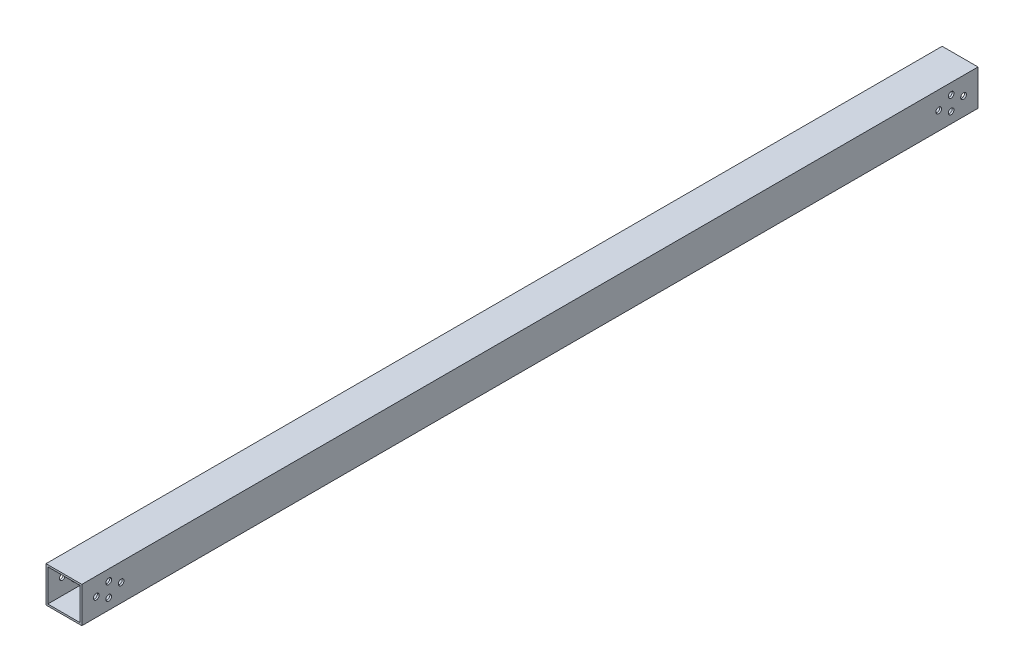
ISO-10303-21;
HEADER;
FILE_DESCRIPTION(('STEP AP214'),'2;1');
FILE_NAME('part.step','',(''),(''),'','','');
FILE_SCHEMA(('AUTOMOTIVE_DESIGN { 1 0 10303 214 1 1 1 1 }'));
ENDSEC;
DATA;
#1=APPLICATION_CONTEXT('core data for automotive mechanical design processes');
#2=APPLICATION_PROTOCOL_DEFINITION('international standard','automotive_design',2000,#1);
#3=PRODUCT_CONTEXT('',#1,'mechanical');
#4=PRODUCT('Part','Part','',(#3));
#5=PRODUCT_RELATED_PRODUCT_CATEGORY('part','',(#4));
#6=PRODUCT_DEFINITION_FORMATION('','',#4);
#7=PRODUCT_DEFINITION_CONTEXT('part definition',#1,'design');
#8=PRODUCT_DEFINITION('design','',#6,#7);
#9=PRODUCT_DEFINITION_SHAPE('','',#8);
#10=(LENGTH_UNIT() NAMED_UNIT(*) SI_UNIT(.MILLI.,.METRE.));
#11=(NAMED_UNIT(*) PLANE_ANGLE_UNIT() SI_UNIT($,.RADIAN.));
#12=(NAMED_UNIT(*) SI_UNIT($,.STERADIAN.) SOLID_ANGLE_UNIT());
#13=UNCERTAINTY_MEASURE_WITH_UNIT(LENGTH_MEASURE(1.E-05),#10,'distance_accuracy_value','');
#14=(GEOMETRIC_REPRESENTATION_CONTEXT(3) GLOBAL_UNCERTAINTY_ASSIGNED_CONTEXT((#13)) GLOBAL_UNIT_ASSIGNED_CONTEXT((#10,
#11,#12)) REPRESENTATION_CONTEXT('',''));
#15=CARTESIAN_POINT('',(0.,0.,0.));
#16=DIRECTION('',(0.,0.,1.));
#17=DIRECTION('',(1.,0.,0.));
#18=AXIS2_PLACEMENT_3D('',#15,#16,#17);
#19=CARTESIAN_POINT('',(0.,0.,500.));
#20=DIRECTION('',(0.,0.,1.));
#21=DIRECTION('',(1.,0.,0.));
#22=AXIS2_PLACEMENT_3D('',#19,#20,#21);
#23=PLANE('',#22);
#24=DIRECTION('',(0.,-1.,0.));
#25=VECTOR('',#24,1.);
#26=CARTESIAN_POINT('',(-10.,-10.,500.));
#27=LINE('',#26,#25);
#28=CARTESIAN_POINT('',(-10.,10.,500.));
#29=VERTEX_POINT('',#28);
#30=CARTESIAN_POINT('',(-10.,-10.,500.));
#31=VERTEX_POINT('',#30);
#32=EDGE_CURVE('E161',#29,#31,#27,.T.);
#33=ORIENTED_EDGE('',*,*,#32,.T.);
#34=DIRECTION('',(1.,0.,0.));
#35=VECTOR('',#34,1.);
#36=CARTESIAN_POINT('',(10.,-10.,500.));
#37=LINE('',#36,#35);
#38=CARTESIAN_POINT('',(10.,-10.,500.));
#39=VERTEX_POINT('',#38);
#40=EDGE_CURVE('E165',#31,#39,#37,.T.);
#41=ORIENTED_EDGE('',*,*,#40,.T.);
#42=DIRECTION('',(0.,1.,0.));
#43=VECTOR('',#42,1.);
#44=CARTESIAN_POINT('',(10.,-10.,500.));
#45=LINE('',#44,#43);
#46=CARTESIAN_POINT('',(10.,10.,500.));
#47=VERTEX_POINT('',#46);
#48=EDGE_CURVE('E169',#39,#47,#45,.T.);
#49=ORIENTED_EDGE('',*,*,#48,.T.);
#50=DIRECTION('',(-1.,0.,0.));
#51=VECTOR('',#50,1.);
#52=CARTESIAN_POINT('',(10.,10.,500.));
#53=LINE('',#52,#51);
#54=EDGE_CURVE('E172',#47,#29,#53,.T.);
#55=ORIENTED_EDGE('',*,*,#54,.T.);
#56=EDGE_LOOP('',(#33,#41,#49,#55));
#57=FACE_BOUND('',#56,.T.);
#58=DIRECTION('',(1.,0.,0.));
#59=VECTOR('',#58,1.);
#60=CARTESIAN_POINT('',(9.00000000000001,-9.,500.));
#61=LINE('',#60,#59);
#62=CARTESIAN_POINT('',(-9.,-9.,500.));
#63=VERTEX_POINT('',#62);
#64=CARTESIAN_POINT('',(9.00000000000001,-9.,500.));
#65=VERTEX_POINT('',#64);
#66=EDGE_CURVE('E120',#63,#65,#61,.T.);
#67=ORIENTED_EDGE('',*,*,#66,.F.);
#68=DIRECTION('',(0.,-1.,0.));
#69=VECTOR('',#68,1.);
#70=CARTESIAN_POINT('',(-9.,-9.,500.));
#71=LINE('',#70,#69);
#72=CARTESIAN_POINT('',(-9.,9.,500.));
#73=VERTEX_POINT('',#72);
#74=EDGE_CURVE('E111',#73,#63,#71,.T.);
#75=ORIENTED_EDGE('',*,*,#74,.F.);
#76=DIRECTION('',(-1.,0.,0.));
#77=VECTOR('',#76,1.);
#78=CARTESIAN_POINT('',(9.00000000000001,9.,500.));
#79=LINE('',#78,#77);
#80=CARTESIAN_POINT('',(9.00000000000001,9.,500.));
#81=VERTEX_POINT('',#80);
#82=EDGE_CURVE('E137',#81,#73,#79,.T.);
#83=ORIENTED_EDGE('',*,*,#82,.F.);
#84=DIRECTION('',(0.,1.,0.));
#85=VECTOR('',#84,1.);
#86=CARTESIAN_POINT('',(9.00000000000001,-9.,500.));
#87=LINE('',#86,#85);
#88=EDGE_CURVE('E133',#65,#81,#87,.T.);
#89=ORIENTED_EDGE('',*,*,#88,.F.);
#90=EDGE_LOOP('',(#67,#75,#83,#89));
#91=FACE_BOUND('',#90,.T.);
#92=ADVANCED_FACE('F43',(#57,#91),#23,.T.);
#93=CARTESIAN_POINT('',(0.,0.,0.));
#94=DIRECTION('',(0.,0.,1.));
#95=DIRECTION('',(1.,0.,0.));
#96=AXIS2_PLACEMENT_3D('',#93,#94,#95);
#97=PLANE('',#96);
#98=DIRECTION('',(0.,-1.,0.));
#99=VECTOR('',#98,1.);
#100=CARTESIAN_POINT('',(-10.,-10.,0.));
#101=LINE('',#100,#99);
#102=CARTESIAN_POINT('',(-10.,10.,0.));
#103=VERTEX_POINT('',#102);
#104=CARTESIAN_POINT('',(-10.,-10.,0.));
#105=VERTEX_POINT('',#104);
#106=EDGE_CURVE('E129',#103,#105,#101,.T.);
#107=ORIENTED_EDGE('',*,*,#106,.F.);
#108=DIRECTION('',(-1.,0.,0.));
#109=VECTOR('',#108,1.);
#110=CARTESIAN_POINT('',(10.,10.,0.));
#111=LINE('',#110,#109);
#112=CARTESIAN_POINT('',(10.,10.,0.));
#113=VERTEX_POINT('',#112);
#114=EDGE_CURVE('E166',#113,#103,#111,.T.);
#115=ORIENTED_EDGE('',*,*,#114,.F.);
#116=DIRECTION('',(0.,1.,0.));
#117=VECTOR('',#116,1.);
#118=CARTESIAN_POINT('',(10.,-10.,0.));
#119=LINE('',#118,#117);
#120=CARTESIAN_POINT('',(10.,-10.,0.));
#121=VERTEX_POINT('',#120);
#122=EDGE_CURVE('E182',#121,#113,#119,.T.);
#123=ORIENTED_EDGE('',*,*,#122,.F.);
#124=DIRECTION('',(1.,0.,0.));
#125=VECTOR('',#124,1.);
#126=CARTESIAN_POINT('',(10.,-10.,0.));
#127=LINE('',#126,#125);
#128=EDGE_CURVE('E179',#105,#121,#127,.T.);
#129=ORIENTED_EDGE('',*,*,#128,.F.);
#130=EDGE_LOOP('',(#107,#115,#123,#129));
#131=FACE_BOUND('',#130,.T.);
#132=DIRECTION('',(0.,-1.,0.));
#133=VECTOR('',#132,1.);
#134=CARTESIAN_POINT('',(-9.,-9.,0.));
#135=LINE('',#134,#133);
#136=CARTESIAN_POINT('',(-9.,9.,0.));
#137=VERTEX_POINT('',#136);
#138=CARTESIAN_POINT('',(-9.,-9.,0.));
#139=VERTEX_POINT('',#138);
#140=EDGE_CURVE('E69',#137,#139,#135,.T.);
#141=ORIENTED_EDGE('',*,*,#140,.T.);
#142=DIRECTION('',(1.,0.,0.));
#143=VECTOR('',#142,1.);
#144=CARTESIAN_POINT('',(9.00000000000001,-9.,0.));
#145=LINE('',#144,#143);
#146=CARTESIAN_POINT('',(9.00000000000001,-9.,0.));
#147=VERTEX_POINT('',#146);
#148=EDGE_CURVE('E127',#139,#147,#145,.T.);
#149=ORIENTED_EDGE('',*,*,#148,.T.);
#150=DIRECTION('',(0.,1.,0.));
#151=VECTOR('',#150,1.);
#152=CARTESIAN_POINT('',(9.00000000000001,-9.,0.));
#153=LINE('',#152,#151);
#154=CARTESIAN_POINT('',(9.00000000000001,9.,0.));
#155=VERTEX_POINT('',#154);
#156=EDGE_CURVE('E148',#147,#155,#153,.T.);
#157=ORIENTED_EDGE('',*,*,#156,.T.);
#158=DIRECTION('',(-1.,0.,0.));
#159=VECTOR('',#158,1.);
#160=CARTESIAN_POINT('',(9.00000000000001,9.,0.));
#161=LINE('',#160,#159);
#162=EDGE_CURVE('E121',#155,#137,#161,.T.);
#163=ORIENTED_EDGE('',*,*,#162,.T.);
#164=EDGE_LOOP('',(#141,#149,#157,#163));
#165=FACE_BOUND('',#164,.T.);
#166=ADVANCED_FACE('F274',(#131,#165),#97,.F.);
#167=CARTESIAN_POINT('',(-10.,-10.,500.));
#168=DIRECTION('',(1.,0.,0.));
#169=DIRECTION('',(0.,1.,0.));
#170=AXIS2_PLACEMENT_3D('',#167,#168,#169);
#171=PLANE('',#170);
#172=CARTESIAN_POINT('',(-10.,0.,491.928203230275));
#173=DIRECTION('',(-1.,0.,0.));
#174=DIRECTION('',(0.,1.,0.));
#175=AXIS2_PLACEMENT_3D('',#172,#173,#174);
#176=CIRCLE('',#175,1.59999999999997);
#177=CARTESIAN_POINT('',(-10.,1.59999999999997,491.928203230275));
#178=VERTEX_POINT('',#177);
#179=EDGE_CURVE('E327',#178,#178,#176,.T.);
#180=ORIENTED_EDGE('',*,*,#179,.F.);
#181=EDGE_LOOP('',(#180));
#182=FACE_BOUND('',#181,.T.);
#183=CARTESIAN_POINT('',(-10.,-3.99999999999999,485.));
#184=DIRECTION('',(-1.,0.,0.));
#185=DIRECTION('',(0.,1.,0.));
#186=AXIS2_PLACEMENT_3D('',#183,#184,#185);
#187=CIRCLE('',#186,1.60000000000002);
#188=CARTESIAN_POINT('',(-10.,-2.39999999999998,485.));
#189=VERTEX_POINT('',#188);
#190=EDGE_CURVE('E331',#189,#189,#187,.T.);
#191=ORIENTED_EDGE('',*,*,#190,.F.);
#192=EDGE_LOOP('',(#191));
#193=FACE_BOUND('',#192,.T.);
#194=CARTESIAN_POINT('',(-10.,4.,485.));
#195=DIRECTION('',(-1.,0.,0.));
#196=DIRECTION('',(0.,1.,0.));
#197=AXIS2_PLACEMENT_3D('',#194,#195,#196);
#198=CIRCLE('',#197,1.60000000000002);
#199=CARTESIAN_POINT('',(-10.,5.60000000000002,485.));
#200=VERTEX_POINT('',#199);
#201=EDGE_CURVE('E335',#200,#200,#198,.T.);
#202=ORIENTED_EDGE('',*,*,#201,.F.);
#203=EDGE_LOOP('',(#202));
#204=FACE_BOUND('',#203,.T.);
#205=CARTESIAN_POINT('',(-10.,0.,478.071796769724));
#206=DIRECTION('',(-1.,0.,0.));
#207=DIRECTION('',(0.,1.,0.));
#208=AXIS2_PLACEMENT_3D('',#205,#206,#207);
#209=CIRCLE('',#208,1.60000000000002);
#210=CARTESIAN_POINT('',(-10.,1.60000000000002,478.071796769724));
#211=VERTEX_POINT('',#210);
#212=EDGE_CURVE('E339',#211,#211,#209,.T.);
#213=ORIENTED_EDGE('',*,*,#212,.F.);
#214=EDGE_LOOP('',(#213));
#215=FACE_BOUND('',#214,.T.);
#216=CARTESIAN_POINT('',(-10.,0.,21.9282032302755));
#217=DIRECTION('',(-1.,0.,0.));
#218=DIRECTION('',(0.,-1.,0.));
#219=AXIS2_PLACEMENT_3D('',#216,#217,#218);
#220=CIRCLE('',#219,1.6);
#221=CARTESIAN_POINT('',(-10.,-1.6,21.9282032302755));
#222=VERTEX_POINT('',#221);
#223=EDGE_CURVE('E343',#222,#222,#220,.T.);
#224=ORIENTED_EDGE('',*,*,#223,.F.);
#225=EDGE_LOOP('',(#224));
#226=FACE_BOUND('',#225,.T.);
#227=CARTESIAN_POINT('',(-10.,0.,8.07179676972449));
#228=DIRECTION('',(-1.,0.,0.));
#229=DIRECTION('',(0.,-1.,0.));
#230=AXIS2_PLACEMENT_3D('',#227,#228,#229);
#231=CIRCLE('',#230,1.6);
#232=CARTESIAN_POINT('',(-10.,-1.6,8.07179676972449));
#233=VERTEX_POINT('',#232);
#234=EDGE_CURVE('E347',#233,#233,#231,.T.);
#235=ORIENTED_EDGE('',*,*,#234,.F.);
#236=EDGE_LOOP('',(#235));
#237=FACE_BOUND('',#236,.T.);
#238=CARTESIAN_POINT('',(-10.,4.,15.));
#239=DIRECTION('',(-1.,0.,0.));
#240=DIRECTION('',(0.,-1.,0.));
#241=AXIS2_PLACEMENT_3D('',#238,#239,#240);
#242=CIRCLE('',#241,1.6);
#243=CARTESIAN_POINT('',(-10.,2.4,15.));
#244=VERTEX_POINT('',#243);
#245=EDGE_CURVE('E351',#244,#244,#242,.T.);
#246=ORIENTED_EDGE('',*,*,#245,.F.);
#247=EDGE_LOOP('',(#246));
#248=FACE_BOUND('',#247,.T.);
#249=CARTESIAN_POINT('',(-10.,-4.,15.));
#250=DIRECTION('',(-1.,0.,0.));
#251=DIRECTION('',(0.,-1.,0.));
#252=AXIS2_PLACEMENT_3D('',#249,#250,#251);
#253=CIRCLE('',#252,1.6);
#254=CARTESIAN_POINT('',(-10.,-5.6,15.));
#255=VERTEX_POINT('',#254);
#256=EDGE_CURVE('E354',#255,#255,#253,.T.);
#257=ORIENTED_EDGE('',*,*,#256,.F.);
#258=EDGE_LOOP('',(#257));
#259=FACE_BOUND('',#258,.T.);
#260=ORIENTED_EDGE('',*,*,#106,.T.);
#261=DIRECTION('',(0.,0.,-1.));
#262=VECTOR('',#261,1.);
#263=CARTESIAN_POINT('',(-10.,-10.,500.));
#264=LINE('',#263,#262);
#265=EDGE_CURVE('E11',#31,#105,#264,.T.);
#266=ORIENTED_EDGE('',*,*,#265,.F.);
#267=ORIENTED_EDGE('',*,*,#32,.F.);
#268=DIRECTION('',(0.,0.,-1.));
#269=VECTOR('',#268,1.);
#270=CARTESIAN_POINT('',(-10.,10.,500.));
#271=LINE('',#270,#269);
#272=EDGE_CURVE('E175',#29,#103,#271,.T.);
#273=ORIENTED_EDGE('',*,*,#272,.T.);
#274=EDGE_LOOP('',(#260,#266,#267,#273));
#275=FACE_BOUND('',#274,.T.);
#276=ADVANCED_FACE('F45',(#182,#193,#204,#215,#226,#237,#248,#259,#275),#171,.F.);
#277=CARTESIAN_POINT('',(10.,-10.,500.));
#278=DIRECTION('',(0.,1.,0.));
#279=DIRECTION('',(-1.,0.,0.));
#280=AXIS2_PLACEMENT_3D('',#277,#278,#279);
#281=PLANE('',#280);
#282=ORIENTED_EDGE('',*,*,#128,.T.);
#283=DIRECTION('',(0.,0.,-1.));
#284=VECTOR('',#283,1.);
#285=CARTESIAN_POINT('',(10.,-10.,500.));
#286=LINE('',#285,#284);
#287=EDGE_CURVE('E53',#39,#121,#286,.T.);
#288=ORIENTED_EDGE('',*,*,#287,.F.);
#289=ORIENTED_EDGE('',*,*,#40,.F.);
#290=ORIENTED_EDGE('',*,*,#265,.T.);
#291=EDGE_LOOP('',(#282,#288,#289,#290));
#292=FACE_BOUND('',#291,.T.);
#293=ADVANCED_FACE('F302',(#292),#281,.F.);
#294=CARTESIAN_POINT('',(10.,-10.,500.));
#295=DIRECTION('',(-1.,0.,0.));
#296=DIRECTION('',(0.,0.,1.));
#297=AXIS2_PLACEMENT_3D('',#294,#295,#296);
#298=PLANE('',#297);
#299=CARTESIAN_POINT('',(10.,0.,491.928203230275));
#300=DIRECTION('',(-1.,0.,0.));
#301=DIRECTION('',(0.,0.,1.));
#302=AXIS2_PLACEMENT_3D('',#299,#300,#301);
#303=CIRCLE('',#302,1.59999999999997);
#304=CARTESIAN_POINT('',(10.,0.,493.528203230275));
#305=VERTEX_POINT('',#304);
#306=EDGE_CURVE('E464',#305,#305,#303,.F.);
#307=ORIENTED_EDGE('',*,*,#306,.F.);
#308=EDGE_LOOP('',(#307));
#309=FACE_BOUND('',#308,.T.);
#310=CARTESIAN_POINT('',(10.,-3.99999999999999,485.));
#311=DIRECTION('',(-1.,0.,0.));
#312=DIRECTION('',(0.,0.,1.));
#313=AXIS2_PLACEMENT_3D('',#310,#311,#312);
#314=CIRCLE('',#313,1.60000000000002);
#315=CARTESIAN_POINT('',(10.,-3.99999999999999,486.6));
#316=VERTEX_POINT('',#315);
#317=EDGE_CURVE('E459',#316,#316,#314,.F.);
#318=ORIENTED_EDGE('',*,*,#317,.F.);
#319=EDGE_LOOP('',(#318));
#320=FACE_BOUND('',#319,.T.);
#321=CARTESIAN_POINT('',(10.,4.,485.));
#322=DIRECTION('',(-1.,0.,0.));
#323=DIRECTION('',(0.,0.,1.));
#324=AXIS2_PLACEMENT_3D('',#321,#322,#323);
#325=CIRCLE('',#324,1.60000000000002);
#326=CARTESIAN_POINT('',(10.,4.,486.6));
#327=VERTEX_POINT('',#326);
#328=EDGE_CURVE('E453',#327,#327,#325,.F.);
#329=ORIENTED_EDGE('',*,*,#328,.F.);
#330=EDGE_LOOP('',(#329));
#331=FACE_BOUND('',#330,.T.);
#332=CARTESIAN_POINT('',(10.,0.,478.071796769724));
#333=DIRECTION('',(-1.,0.,0.));
#334=DIRECTION('',(0.,0.,1.));
#335=AXIS2_PLACEMENT_3D('',#332,#333,#334);
#336=CIRCLE('',#335,1.60000000000002);
#337=CARTESIAN_POINT('',(10.,0.,479.671796769725));
#338=VERTEX_POINT('',#337);
#339=EDGE_CURVE('E447',#338,#338,#336,.F.);
#340=ORIENTED_EDGE('',*,*,#339,.F.);
#341=EDGE_LOOP('',(#340));
#342=FACE_BOUND('',#341,.T.);
#343=CARTESIAN_POINT('',(10.,0.,21.9282032302755));
#344=DIRECTION('',(-1.,0.,0.));
#345=DIRECTION('',(0.,0.,1.));
#346=AXIS2_PLACEMENT_3D('',#343,#344,#345);
#347=CIRCLE('',#346,1.6);
#348=CARTESIAN_POINT('',(10.,0.,23.5282032302755));
#349=VERTEX_POINT('',#348);
#350=EDGE_CURVE('E441',#349,#349,#347,.F.);
#351=ORIENTED_EDGE('',*,*,#350,.F.);
#352=EDGE_LOOP('',(#351));
#353=FACE_BOUND('',#352,.T.);
#354=CARTESIAN_POINT('',(10.,0.,8.07179676972449));
#355=DIRECTION('',(-1.,0.,0.));
#356=DIRECTION('',(0.,0.,1.));
#357=AXIS2_PLACEMENT_3D('',#354,#355,#356);
#358=CIRCLE('',#357,1.6);
#359=CARTESIAN_POINT('',(10.,0.,9.67179676972449));
#360=VERTEX_POINT('',#359);
#361=EDGE_CURVE('E435',#360,#360,#358,.F.);
#362=ORIENTED_EDGE('',*,*,#361,.F.);
#363=EDGE_LOOP('',(#362));
#364=FACE_BOUND('',#363,.T.);
#365=CARTESIAN_POINT('',(10.,4.,15.));
#366=DIRECTION('',(-1.,0.,0.));
#367=DIRECTION('',(0.,0.,1.));
#368=AXIS2_PLACEMENT_3D('',#365,#366,#367);
#369=CIRCLE('',#368,1.6);
#370=CARTESIAN_POINT('',(10.,4.,16.6));
#371=VERTEX_POINT('',#370);
#372=EDGE_CURVE('E362',#371,#371,#369,.F.);
#373=ORIENTED_EDGE('',*,*,#372,.F.);
#374=EDGE_LOOP('',(#373));
#375=FACE_BOUND('',#374,.T.);
#376=CARTESIAN_POINT('',(10.,-4.,15.));
#377=DIRECTION('',(-1.,0.,0.));
#378=DIRECTION('',(0.,0.,1.));
#379=AXIS2_PLACEMENT_3D('',#376,#377,#378);
#380=CIRCLE('',#379,1.6);
#381=CARTESIAN_POINT('',(10.,-4.,16.6));
#382=VERTEX_POINT('',#381);
#383=EDGE_CURVE('E202',#382,#382,#380,.F.);
#384=ORIENTED_EDGE('',*,*,#383,.F.);
#385=EDGE_LOOP('',(#384));
#386=FACE_BOUND('',#385,.T.);
#387=ORIENTED_EDGE('',*,*,#122,.T.);
#388=DIRECTION('',(0.,0.,-1.));
#389=VECTOR('',#388,1.);
#390=CARTESIAN_POINT('',(10.,10.,500.));
#391=LINE('',#390,#389);
#392=EDGE_CURVE('E190',#47,#113,#391,.T.);
#393=ORIENTED_EDGE('',*,*,#392,.F.);
#394=ORIENTED_EDGE('',*,*,#48,.F.);
#395=ORIENTED_EDGE('',*,*,#287,.T.);
#396=EDGE_LOOP('',(#387,#393,#394,#395));
#397=FACE_BOUND('',#396,.T.);
#398=ADVANCED_FACE('F299',(#309,#320,#331,#342,#353,#364,#375,#386,#397),#298,.F.);
#399=CARTESIAN_POINT('',(10.,10.,500.));
#400=DIRECTION('',(0.,-1.,0.));
#401=DIRECTION('',(0.,0.,-1.));
#402=AXIS2_PLACEMENT_3D('',#399,#400,#401);
#403=PLANE('',#402);
#404=ORIENTED_EDGE('',*,*,#114,.T.);
#405=ORIENTED_EDGE('',*,*,#272,.F.);
#406=ORIENTED_EDGE('',*,*,#54,.F.);
#407=ORIENTED_EDGE('',*,*,#392,.T.);
#408=EDGE_LOOP('',(#404,#405,#406,#407));
#409=FACE_BOUND('',#408,.T.);
#410=ADVANCED_FACE('F296',(#409),#403,.F.);
#411=CARTESIAN_POINT('',(-9.,-9.,500.));
#412=DIRECTION('',(1.,0.,0.));
#413=DIRECTION('',(0.,0.,-1.));
#414=AXIS2_PLACEMENT_3D('',#411,#412,#413);
#415=PLANE('',#414);
#416=CARTESIAN_POINT('',(-9.,0.,491.928203230275));
#417=DIRECTION('',(1.,0.,0.));
#418=DIRECTION('',(0.,0.,-1.));
#419=AXIS2_PLACEMENT_3D('',#416,#417,#418);
#420=CIRCLE('',#419,1.59999999999997);
#421=CARTESIAN_POINT('',(-9.,0.,490.328203230276));
#422=VERTEX_POINT('',#421);
#423=EDGE_CURVE('E145',#422,#422,#420,.T.);
#424=ORIENTED_EDGE('',*,*,#423,.F.);
#425=EDGE_LOOP('',(#424));
#426=FACE_BOUND('',#425,.T.);
#427=CARTESIAN_POINT('',(-9.,-3.99999999999999,485.));
#428=DIRECTION('',(1.,0.,0.));
#429=DIRECTION('',(0.,0.,-1.));
#430=AXIS2_PLACEMENT_3D('',#427,#428,#429);
#431=CIRCLE('',#430,1.60000000000002);
#432=CARTESIAN_POINT('',(-9.,-3.99999999999999,483.4));
#433=VERTEX_POINT('',#432);
#434=EDGE_CURVE('E230',#433,#433,#431,.T.);
#435=ORIENTED_EDGE('',*,*,#434,.F.);
#436=EDGE_LOOP('',(#435));
#437=FACE_BOUND('',#436,.T.);
#438=CARTESIAN_POINT('',(-9.,4.,485.));
#439=DIRECTION('',(1.,0.,0.));
#440=DIRECTION('',(0.,0.,-1.));
#441=AXIS2_PLACEMENT_3D('',#438,#439,#440);
#442=CIRCLE('',#441,1.60000000000002);
#443=CARTESIAN_POINT('',(-9.,4.,483.4));
#444=VERTEX_POINT('',#443);
#445=EDGE_CURVE('E226',#444,#444,#442,.T.);
#446=ORIENTED_EDGE('',*,*,#445,.F.);
#447=EDGE_LOOP('',(#446));
#448=FACE_BOUND('',#447,.T.);
#449=CARTESIAN_POINT('',(-9.,0.,478.071796769724));
#450=DIRECTION('',(1.,0.,0.));
#451=DIRECTION('',(0.,0.,-1.));
#452=AXIS2_PLACEMENT_3D('',#449,#450,#451);
#453=CIRCLE('',#452,1.60000000000002);
#454=CARTESIAN_POINT('',(-9.,0.,476.471796769724));
#455=VERTEX_POINT('',#454);
#456=EDGE_CURVE('E222',#455,#455,#453,.T.);
#457=ORIENTED_EDGE('',*,*,#456,.F.);
#458=EDGE_LOOP('',(#457));
#459=FACE_BOUND('',#458,.T.);
#460=CARTESIAN_POINT('',(-9.,0.,21.9282032302755));
#461=DIRECTION('',(1.,0.,0.));
#462=DIRECTION('',(0.,0.,-1.));
#463=AXIS2_PLACEMENT_3D('',#460,#461,#462);
#464=CIRCLE('',#463,1.6);
#465=CARTESIAN_POINT('',(-9.,0.,20.3282032302755));
#466=VERTEX_POINT('',#465);
#467=EDGE_CURVE('E217',#466,#466,#464,.T.);
#468=ORIENTED_EDGE('',*,*,#467,.F.);
#469=EDGE_LOOP('',(#468));
#470=FACE_BOUND('',#469,.T.);
#471=CARTESIAN_POINT('',(-9.,0.,8.07179676972449));
#472=DIRECTION('',(1.,0.,0.));
#473=DIRECTION('',(0.,0.,-1.));
#474=AXIS2_PLACEMENT_3D('',#471,#472,#473);
#475=CIRCLE('',#474,1.6);
#476=CARTESIAN_POINT('',(-9.,0.,6.47179676972449));
#477=VERTEX_POINT('',#476);
#478=EDGE_CURVE('E212',#477,#477,#475,.T.);
#479=ORIENTED_EDGE('',*,*,#478,.F.);
#480=EDGE_LOOP('',(#479));
#481=FACE_BOUND('',#480,.T.);
#482=CARTESIAN_POINT('',(-9.,4.,15.));
#483=DIRECTION('',(1.,0.,0.));
#484=DIRECTION('',(0.,0.,-1.));
#485=AXIS2_PLACEMENT_3D('',#482,#483,#484);
#486=CIRCLE('',#485,1.6);
#487=CARTESIAN_POINT('',(-9.,4.,13.4));
#488=VERTEX_POINT('',#487);
#489=EDGE_CURVE('E207',#488,#488,#486,.T.);
#490=ORIENTED_EDGE('',*,*,#489,.F.);
#491=EDGE_LOOP('',(#490));
#492=FACE_BOUND('',#491,.T.);
#493=CARTESIAN_POINT('',(-9.,-4.,15.));
#494=DIRECTION('',(1.,0.,0.));
#495=DIRECTION('',(0.,0.,-1.));
#496=AXIS2_PLACEMENT_3D('',#493,#494,#495);
#497=CIRCLE('',#496,1.6);
#498=CARTESIAN_POINT('',(-9.,-4.,13.4));
#499=VERTEX_POINT('',#498);
#500=EDGE_CURVE('E201',#499,#499,#497,.T.);
#501=ORIENTED_EDGE('',*,*,#500,.F.);
#502=EDGE_LOOP('',(#501));
#503=FACE_BOUND('',#502,.T.);
#504=ORIENTED_EDGE('',*,*,#140,.F.);
#505=DIRECTION('',(0.,0.,-1.));
#506=VECTOR('',#505,1.);
#507=CARTESIAN_POINT('',(-9.,9.,500.));
#508=LINE('',#507,#506);
#509=EDGE_CURVE('E115',#73,#137,#508,.T.);
#510=ORIENTED_EDGE('',*,*,#509,.F.);
#511=ORIENTED_EDGE('',*,*,#74,.T.);
#512=DIRECTION('',(0.,0.,-1.));
#513=VECTOR('',#512,1.);
#514=CARTESIAN_POINT('',(-9.,-9.,500.));
#515=LINE('',#514,#513);
#516=EDGE_CURVE('E114',#63,#139,#515,.T.);
#517=ORIENTED_EDGE('',*,*,#516,.T.);
#518=EDGE_LOOP('',(#504,#510,#511,#517));
#519=FACE_BOUND('',#518,.T.);
#520=ADVANCED_FACE('F113',(#426,#437,#448,#459,#470,#481,#492,#503,#519),#415,.T.);
#521=CARTESIAN_POINT('',(9.00000000000001,-9.,500.));
#522=DIRECTION('',(0.,1.,0.));
#523=DIRECTION('',(0.,0.,1.));
#524=AXIS2_PLACEMENT_3D('',#521,#522,#523);
#525=PLANE('',#524);
#526=ORIENTED_EDGE('',*,*,#148,.F.);
#527=ORIENTED_EDGE('',*,*,#516,.F.);
#528=ORIENTED_EDGE('',*,*,#66,.T.);
#529=DIRECTION('',(0.,0.,-1.));
#530=VECTOR('',#529,1.);
#531=CARTESIAN_POINT('',(9.00000000000001,-9.,500.));
#532=LINE('',#531,#530);
#533=EDGE_CURVE('E130',#65,#147,#532,.T.);
#534=ORIENTED_EDGE('',*,*,#533,.T.);
#535=EDGE_LOOP('',(#526,#527,#528,#534));
#536=FACE_BOUND('',#535,.T.);
#537=ADVANCED_FACE('F124',(#536),#525,.T.);
#538=CARTESIAN_POINT('',(9.00000000000001,-9.,500.));
#539=DIRECTION('',(-1.,0.,0.));
#540=DIRECTION('',(0.,0.,1.));
#541=AXIS2_PLACEMENT_3D('',#538,#539,#540);
#542=PLANE('',#541);
#543=CARTESIAN_POINT('',(9.00000000000001,0.,491.928203230275));
#544=DIRECTION('',(-1.,0.,0.));
#545=DIRECTION('',(0.,0.,1.));
#546=AXIS2_PLACEMENT_3D('',#543,#544,#545);
#547=CIRCLE('',#546,1.59999999999997);
#548=CARTESIAN_POINT('',(9.00000000000001,0.,493.528203230275));
#549=VERTEX_POINT('',#548);
#550=EDGE_CURVE('E47',#549,#549,#547,.T.);
#551=ORIENTED_EDGE('',*,*,#550,.F.);
#552=EDGE_LOOP('',(#551));
#553=FACE_BOUND('',#552,.T.);
#554=CARTESIAN_POINT('',(9.00000000000001,-3.99999999999999,485.));
#555=DIRECTION('',(-1.,0.,0.));
#556=DIRECTION('',(0.,0.,1.));
#557=AXIS2_PLACEMENT_3D('',#554,#555,#556);
#558=CIRCLE('',#557,1.60000000000002);
#559=CARTESIAN_POINT('',(9.00000000000001,-3.99999999999999,486.6));
#560=VERTEX_POINT('',#559);
#561=EDGE_CURVE('E227',#560,#560,#558,.T.);
#562=ORIENTED_EDGE('',*,*,#561,.F.);
#563=EDGE_LOOP('',(#562));
#564=FACE_BOUND('',#563,.T.);
#565=CARTESIAN_POINT('',(9.00000000000001,4.,485.));
#566=DIRECTION('',(-1.,0.,0.));
#567=DIRECTION('',(0.,0.,1.));
#568=AXIS2_PLACEMENT_3D('',#565,#566,#567);
#569=CIRCLE('',#568,1.60000000000002);
#570=CARTESIAN_POINT('',(9.00000000000001,4.,486.6));
#571=VERTEX_POINT('',#570);
#572=EDGE_CURVE('E223',#571,#571,#569,.T.);
#573=ORIENTED_EDGE('',*,*,#572,.F.);
#574=EDGE_LOOP('',(#573));
#575=FACE_BOUND('',#574,.T.);
#576=CARTESIAN_POINT('',(9.00000000000001,0.,478.071796769724));
#577=DIRECTION('',(-1.,0.,0.));
#578=DIRECTION('',(0.,0.,1.));
#579=AXIS2_PLACEMENT_3D('',#576,#577,#578);
#580=CIRCLE('',#579,1.60000000000002);
#581=CARTESIAN_POINT('',(9.00000000000001,0.,479.671796769725));
#582=VERTEX_POINT('',#581);
#583=EDGE_CURVE('E218',#582,#582,#580,.T.);
#584=ORIENTED_EDGE('',*,*,#583,.F.);
#585=EDGE_LOOP('',(#584));
#586=FACE_BOUND('',#585,.T.);
#587=CARTESIAN_POINT('',(9.00000000000001,0.,21.9282032302755));
#588=DIRECTION('',(-1.,0.,0.));
#589=DIRECTION('',(0.,0.,1.));
#590=AXIS2_PLACEMENT_3D('',#587,#588,#589);
#591=CIRCLE('',#590,1.6);
#592=CARTESIAN_POINT('',(9.00000000000001,0.,23.5282032302755));
#593=VERTEX_POINT('',#592);
#594=EDGE_CURVE('E213',#593,#593,#591,.T.);
#595=ORIENTED_EDGE('',*,*,#594,.F.);
#596=EDGE_LOOP('',(#595));
#597=FACE_BOUND('',#596,.T.);
#598=CARTESIAN_POINT('',(9.00000000000001,0.,8.07179676972449));
#599=DIRECTION('',(-1.,0.,0.));
#600=DIRECTION('',(0.,0.,1.));
#601=AXIS2_PLACEMENT_3D('',#598,#599,#600);
#602=CIRCLE('',#601,1.6);
#603=CARTESIAN_POINT('',(9.00000000000001,0.,9.67179676972449));
#604=VERTEX_POINT('',#603);
#605=EDGE_CURVE('E208',#604,#604,#602,.T.);
#606=ORIENTED_EDGE('',*,*,#605,.F.);
#607=EDGE_LOOP('',(#606));
#608=FACE_BOUND('',#607,.T.);
#609=CARTESIAN_POINT('',(9.00000000000001,4.,15.));
#610=DIRECTION('',(-1.,0.,0.));
#611=DIRECTION('',(0.,0.,1.));
#612=AXIS2_PLACEMENT_3D('',#609,#610,#611);
#613=CIRCLE('',#612,1.6);
#614=CARTESIAN_POINT('',(9.00000000000001,4.,16.6));
#615=VERTEX_POINT('',#614);
#616=EDGE_CURVE('E203',#615,#615,#613,.T.);
#617=ORIENTED_EDGE('',*,*,#616,.F.);
#618=EDGE_LOOP('',(#617));
#619=FACE_BOUND('',#618,.T.);
#620=CARTESIAN_POINT('',(9.00000000000001,-4.,15.));
#621=DIRECTION('',(-1.,0.,0.));
#622=DIRECTION('',(0.,0.,1.));
#623=AXIS2_PLACEMENT_3D('',#620,#621,#622);
#624=CIRCLE('',#623,1.6);
#625=CARTESIAN_POINT('',(9.00000000000001,-4.,16.6));
#626=VERTEX_POINT('',#625);
#627=EDGE_CURVE('E197',#626,#626,#624,.T.);
#628=ORIENTED_EDGE('',*,*,#627,.F.);
#629=EDGE_LOOP('',(#628));
#630=FACE_BOUND('',#629,.T.);
#631=ORIENTED_EDGE('',*,*,#156,.F.);
#632=ORIENTED_EDGE('',*,*,#533,.F.);
#633=ORIENTED_EDGE('',*,*,#88,.T.);
#634=DIRECTION('',(0.,0.,-1.));
#635=VECTOR('',#634,1.);
#636=CARTESIAN_POINT('',(9.00000000000001,9.,500.));
#637=LINE('',#636,#635);
#638=EDGE_CURVE('E61',#81,#155,#637,.T.);
#639=ORIENTED_EDGE('',*,*,#638,.T.);
#640=EDGE_LOOP('',(#631,#632,#633,#639));
#641=FACE_BOUND('',#640,.T.);
#642=ADVANCED_FACE('F254',(#553,#564,#575,#586,#597,#608,#619,#630,#641),#542,.T.);
#643=CARTESIAN_POINT('',(9.00000000000001,9.,500.));
#644=DIRECTION('',(0.,-1.,0.));
#645=DIRECTION('',(0.,0.,-1.));
#646=AXIS2_PLACEMENT_3D('',#643,#644,#645);
#647=PLANE('',#646);
#648=ORIENTED_EDGE('',*,*,#162,.F.);
#649=ORIENTED_EDGE('',*,*,#638,.F.);
#650=ORIENTED_EDGE('',*,*,#82,.T.);
#651=ORIENTED_EDGE('',*,*,#509,.T.);
#652=EDGE_LOOP('',(#648,#649,#650,#651));
#653=FACE_BOUND('',#652,.T.);
#654=ADVANCED_FACE('F257',(#653),#647,.T.);
#655=CARTESIAN_POINT('',(14.525483399594,-4.,15.));
#656=DIRECTION('',(-1.,0.,0.));
#657=DIRECTION('',(0.,-1.,0.));
#658=AXIS2_PLACEMENT_3D('',#655,#656,#657);
#659=CYLINDRICAL_SURFACE('',#658,1.6);
#660=ORIENTED_EDGE('',*,*,#627,.T.);
#661=EDGE_LOOP('',(#660));
#662=FACE_BOUND('',#661,.T.);
#663=ORIENTED_EDGE('',*,*,#383,.T.);
#664=EDGE_LOOP('',(#663));
#665=FACE_BOUND('',#664,.T.);
#666=ADVANCED_FACE('F276',(#662,#665),#659,.F.);
#667=CARTESIAN_POINT('',(14.525483399594,4.,15.));
#668=DIRECTION('',(-1.,0.,0.));
#669=DIRECTION('',(0.,-1.,0.));
#670=AXIS2_PLACEMENT_3D('',#667,#668,#669);
#671=CYLINDRICAL_SURFACE('',#670,1.6);
#672=ORIENTED_EDGE('',*,*,#616,.T.);
#673=EDGE_LOOP('',(#672));
#674=FACE_BOUND('',#673,.T.);
#675=ORIENTED_EDGE('',*,*,#372,.T.);
#676=EDGE_LOOP('',(#675));
#677=FACE_BOUND('',#676,.T.);
#678=ADVANCED_FACE('F281',(#674,#677),#671,.F.);
#679=CARTESIAN_POINT('',(14.525483399594,0.,8.07179676972449));
#680=DIRECTION('',(-1.,0.,0.));
#681=DIRECTION('',(0.,-1.,0.));
#682=AXIS2_PLACEMENT_3D('',#679,#680,#681);
#683=CYLINDRICAL_SURFACE('',#682,1.6);
#684=ORIENTED_EDGE('',*,*,#605,.T.);
#685=EDGE_LOOP('',(#684));
#686=FACE_BOUND('',#685,.T.);
#687=ORIENTED_EDGE('',*,*,#361,.T.);
#688=EDGE_LOOP('',(#687));
#689=FACE_BOUND('',#688,.T.);
#690=ADVANCED_FACE('F420',(#686,#689),#683,.F.);
#691=CARTESIAN_POINT('',(14.525483399594,0.,21.9282032302755));
#692=DIRECTION('',(-1.,0.,0.));
#693=DIRECTION('',(0.,-1.,0.));
#694=AXIS2_PLACEMENT_3D('',#691,#692,#693);
#695=CYLINDRICAL_SURFACE('',#694,1.6);
#696=ORIENTED_EDGE('',*,*,#594,.T.);
#697=EDGE_LOOP('',(#696));
#698=FACE_BOUND('',#697,.T.);
#699=ORIENTED_EDGE('',*,*,#350,.T.);
#700=EDGE_LOOP('',(#699));
#701=FACE_BOUND('',#700,.T.);
#702=ADVANCED_FACE('F415',(#698,#701),#695,.F.);
#703=CARTESIAN_POINT('',(14.525483399594,0.,478.071796769724));
#704=DIRECTION('',(-1.,0.,0.));
#705=DIRECTION('',(0.,-1.,0.));
#706=AXIS2_PLACEMENT_3D('',#703,#704,#705);
#707=CYLINDRICAL_SURFACE('',#706,1.60000000000002);
#708=ORIENTED_EDGE('',*,*,#583,.T.);
#709=EDGE_LOOP('',(#708));
#710=FACE_BOUND('',#709,.T.);
#711=ORIENTED_EDGE('',*,*,#339,.T.);
#712=EDGE_LOOP('',(#711));
#713=FACE_BOUND('',#712,.T.);
#714=ADVANCED_FACE('F410',(#710,#713),#707,.F.);
#715=CARTESIAN_POINT('',(14.525483399594,4.,485.));
#716=DIRECTION('',(-1.,0.,0.));
#717=DIRECTION('',(0.,-1.,0.));
#718=AXIS2_PLACEMENT_3D('',#715,#716,#717);
#719=CYLINDRICAL_SURFACE('',#718,1.60000000000002);
#720=ORIENTED_EDGE('',*,*,#572,.T.);
#721=EDGE_LOOP('',(#720));
#722=FACE_BOUND('',#721,.T.);
#723=ORIENTED_EDGE('',*,*,#328,.T.);
#724=EDGE_LOOP('',(#723));
#725=FACE_BOUND('',#724,.T.);
#726=ADVANCED_FACE('F406',(#722,#725),#719,.F.);
#727=CARTESIAN_POINT('',(14.525483399594,-3.99999999999999,485.));
#728=DIRECTION('',(-1.,0.,0.));
#729=DIRECTION('',(0.,-1.,0.));
#730=AXIS2_PLACEMENT_3D('',#727,#728,#729);
#731=CYLINDRICAL_SURFACE('',#730,1.60000000000002);
#732=ORIENTED_EDGE('',*,*,#561,.T.);
#733=EDGE_LOOP('',(#732));
#734=FACE_BOUND('',#733,.T.);
#735=ORIENTED_EDGE('',*,*,#317,.T.);
#736=EDGE_LOOP('',(#735));
#737=FACE_BOUND('',#736,.T.);
#738=ADVANCED_FACE('F400',(#734,#737),#731,.F.);
#739=CARTESIAN_POINT('',(14.525483399594,0.,491.928203230275));
#740=DIRECTION('',(-1.,0.,0.));
#741=DIRECTION('',(0.,-1.,0.));
#742=AXIS2_PLACEMENT_3D('',#739,#740,#741);
#743=CYLINDRICAL_SURFACE('',#742,1.59999999999997);
#744=ORIENTED_EDGE('',*,*,#550,.T.);
#745=EDGE_LOOP('',(#744));
#746=FACE_BOUND('',#745,.T.);
#747=ORIENTED_EDGE('',*,*,#306,.T.);
#748=EDGE_LOOP('',(#747));
#749=FACE_BOUND('',#748,.T.);
#750=ADVANCED_FACE('F251',(#746,#749),#743,.F.);
#751=ORIENTED_EDGE('',*,*,#500,.T.);
#752=EDGE_LOOP('',(#751));
#753=FACE_BOUND('',#752,.T.);
#754=ORIENTED_EDGE('',*,*,#256,.T.);
#755=EDGE_LOOP('',(#754));
#756=FACE_BOUND('',#755,.T.);
#757=ADVANCED_FACE('F284',(#753,#756),#659,.F.);
#758=ORIENTED_EDGE('',*,*,#489,.T.);
#759=EDGE_LOOP('',(#758));
#760=FACE_BOUND('',#759,.T.);
#761=ORIENTED_EDGE('',*,*,#245,.T.);
#762=EDGE_LOOP('',(#761));
#763=FACE_BOUND('',#762,.T.);
#764=ADVANCED_FACE('F392',(#760,#763),#671,.F.);
#765=ORIENTED_EDGE('',*,*,#478,.T.);
#766=EDGE_LOOP('',(#765));
#767=FACE_BOUND('',#766,.T.);
#768=ORIENTED_EDGE('',*,*,#234,.T.);
#769=EDGE_LOOP('',(#768));
#770=FACE_BOUND('',#769,.T.);
#771=ADVANCED_FACE('F397',(#767,#770),#683,.F.);
#772=ORIENTED_EDGE('',*,*,#467,.T.);
#773=EDGE_LOOP('',(#772));
#774=FACE_BOUND('',#773,.T.);
#775=ORIENTED_EDGE('',*,*,#223,.T.);
#776=EDGE_LOOP('',(#775));
#777=FACE_BOUND('',#776,.T.);
#778=ADVANCED_FACE('F379',(#774,#777),#695,.F.);
#779=ORIENTED_EDGE('',*,*,#456,.T.);
#780=EDGE_LOOP('',(#779));
#781=FACE_BOUND('',#780,.T.);
#782=ORIENTED_EDGE('',*,*,#212,.T.);
#783=EDGE_LOOP('',(#782));
#784=FACE_BOUND('',#783,.T.);
#785=ADVANCED_FACE('F417',(#781,#784),#707,.F.);
#786=ORIENTED_EDGE('',*,*,#445,.T.);
#787=EDGE_LOOP('',(#786));
#788=FACE_BOUND('',#787,.T.);
#789=ORIENTED_EDGE('',*,*,#201,.T.);
#790=EDGE_LOOP('',(#789));
#791=FACE_BOUND('',#790,.T.);
#792=ADVANCED_FACE('F412',(#788,#791),#719,.F.);
#793=ORIENTED_EDGE('',*,*,#434,.T.);
#794=EDGE_LOOP('',(#793));
#795=FACE_BOUND('',#794,.T.);
#796=ORIENTED_EDGE('',*,*,#190,.T.);
#797=EDGE_LOOP('',(#796));
#798=FACE_BOUND('',#797,.T.);
#799=ADVANCED_FACE('F407',(#795,#798),#731,.F.);
#800=ORIENTED_EDGE('',*,*,#423,.T.);
#801=EDGE_LOOP('',(#800));
#802=FACE_BOUND('',#801,.T.);
#803=ORIENTED_EDGE('',*,*,#179,.T.);
#804=EDGE_LOOP('',(#803));
#805=FACE_BOUND('',#804,.T.);
#806=ADVANCED_FACE('F402',(#802,#805),#743,.F.);
#807=CLOSED_SHELL('',(#92,#166,#276,#293,#398,#410,#520,#537,#642,#654,#666,#678,#690,#702,#714,
#726,#738,#750,#757,#764,#771,#778,#785,#792,#799,#806));
#808=MANIFOLD_SOLID_BREP('B2',#807);
#809=ADVANCED_BREP_SHAPE_REPRESENTATION('',(#18,#808),#14);
#810=SHAPE_DEFINITION_REPRESENTATION(#9,#809);
ENDSEC;
END-ISO-10303-21;
